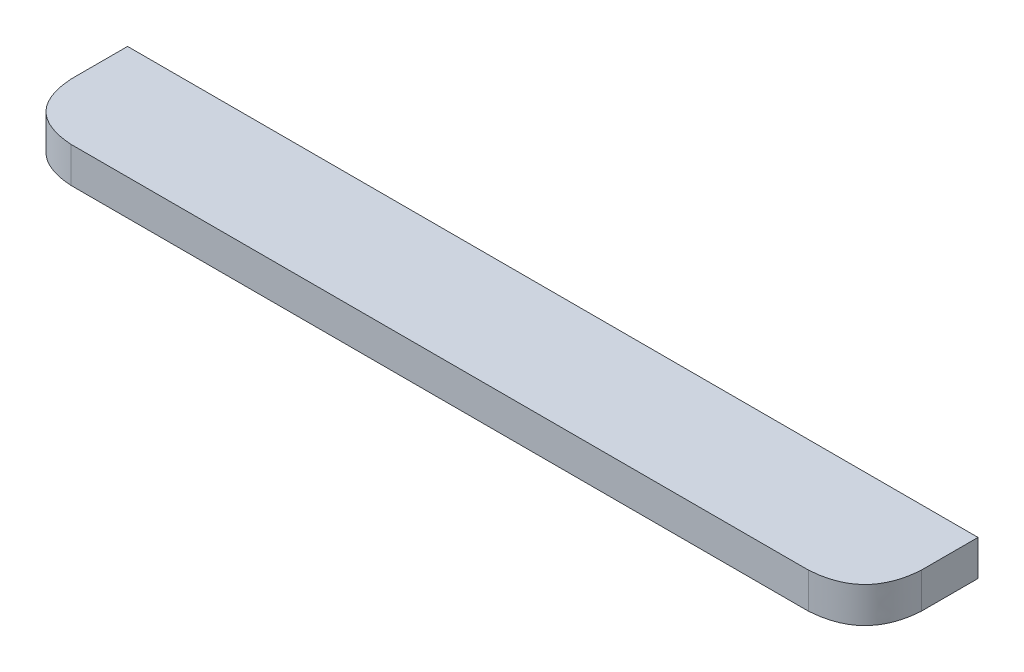
ISO-10303-21;
HEADER;
FILE_DESCRIPTION(('STEP AP214'),'2;1');
FILE_NAME('part.step','',(''),(''),'','','');
FILE_SCHEMA(('AUTOMOTIVE_DESIGN { 1 0 10303 214 1 1 1 1 }'));
ENDSEC;
DATA;
#1=APPLICATION_CONTEXT('core data for automotive mechanical design processes');
#2=APPLICATION_PROTOCOL_DEFINITION('international standard','automotive_design',2000,#1);
#3=PRODUCT_CONTEXT('',#1,'mechanical');
#4=PRODUCT('Part','Part','',(#3));
#5=PRODUCT_RELATED_PRODUCT_CATEGORY('part','',(#4));
#6=PRODUCT_DEFINITION_FORMATION('','',#4);
#7=PRODUCT_DEFINITION_CONTEXT('part definition',#1,'design');
#8=PRODUCT_DEFINITION('design','',#6,#7);
#9=PRODUCT_DEFINITION_SHAPE('','',#8);
#10=(LENGTH_UNIT() NAMED_UNIT(*) SI_UNIT(.MILLI.,.METRE.));
#11=(NAMED_UNIT(*) PLANE_ANGLE_UNIT() SI_UNIT($,.RADIAN.));
#12=(NAMED_UNIT(*) SI_UNIT($,.STERADIAN.) SOLID_ANGLE_UNIT());
#13=UNCERTAINTY_MEASURE_WITH_UNIT(LENGTH_MEASURE(1.E-05),#10,'distance_accuracy_value','');
#14=(GEOMETRIC_REPRESENTATION_CONTEXT(3) GLOBAL_UNCERTAINTY_ASSIGNED_CONTEXT((#13)) GLOBAL_UNIT_ASSIGNED_CONTEXT((#10,
#11,#12)) REPRESENTATION_CONTEXT('',''));
#15=CARTESIAN_POINT('',(0.,0.,0.));
#16=DIRECTION('',(0.,0.,1.));
#17=DIRECTION('',(1.,0.,0.));
#18=AXIS2_PLACEMENT_3D('',#15,#16,#17);
#19=CARTESIAN_POINT('',(95.5039999999999,8.,0.));
#20=DIRECTION('',(-1.,0.,0.));
#21=DIRECTION('',(0.,0.,1.));
#22=AXIS2_PLACEMENT_3D('',#19,#20,#21);
#23=PLANE('',#22);
#24=DIRECTION('',(0.,0.,-1.));
#25=VECTOR('',#24,1.);
#26=CARTESIAN_POINT('',(95.5039999999999,0.,0.));
#27=LINE('',#26,#25);
#28=CARTESIAN_POINT('',(95.504,0.,0.));
#29=VERTEX_POINT('',#28);
#30=CARTESIAN_POINT('',(95.5039999999999,0.,-12.7));
#31=VERTEX_POINT('',#30);
#32=EDGE_CURVE('E138',#29,#31,#27,.T.);
#33=ORIENTED_EDGE('',*,*,#32,.T.);
#34=DIRECTION('',(0.,-1.,0.));
#35=VECTOR('',#34,1.);
#36=CARTESIAN_POINT('',(95.5039999999999,8.,-12.7));
#37=LINE('',#36,#35);
#38=CARTESIAN_POINT('',(95.5039999999999,8.,-12.7));
#39=VERTEX_POINT('',#38);
#40=EDGE_CURVE('E11',#39,#31,#37,.T.);
#41=ORIENTED_EDGE('',*,*,#40,.F.);
#42=DIRECTION('',(0.,0.,-1.));
#43=VECTOR('',#42,1.);
#44=CARTESIAN_POINT('',(95.5039999999999,8.,0.));
#45=LINE('',#44,#43);
#46=CARTESIAN_POINT('',(95.504,8.,0.));
#47=VERTEX_POINT('',#46);
#48=EDGE_CURVE('E189',#47,#39,#45,.T.);
#49=ORIENTED_EDGE('',*,*,#48,.F.);
#50=DIRECTION('',(0.,-1.,0.));
#51=VECTOR('',#50,1.);
#52=CARTESIAN_POINT('',(95.504,8.,0.));
#53=LINE('',#52,#51);
#54=EDGE_CURVE('E128',#47,#29,#53,.T.);
#55=ORIENTED_EDGE('',*,*,#54,.T.);
#56=EDGE_LOOP('',(#33,#41,#49,#55));
#57=FACE_BOUND('',#56,.T.);
#58=ADVANCED_FACE('F43',(#57),#23,.F.);
#59=CARTESIAN_POINT('',(-95.504,8.,-12.7));
#60=DIRECTION('',(0.,0.,1.));
#61=DIRECTION('',(1.,0.,0.));
#62=AXIS2_PLACEMENT_3D('',#59,#60,#61);
#63=PLANE('',#62);
#64=DIRECTION('',(-1.,0.,0.));
#65=VECTOR('',#64,1.);
#66=CARTESIAN_POINT('',(-95.504,0.,-12.7));
#67=LINE('',#66,#65);
#68=CARTESIAN_POINT('',(-95.504,0.,-12.7));
#69=VERTEX_POINT('',#68);
#70=EDGE_CURVE('E163',#31,#69,#67,.T.);
#71=ORIENTED_EDGE('',*,*,#70,.T.);
#72=DIRECTION('',(0.,-1.,0.));
#73=VECTOR('',#72,1.);
#74=CARTESIAN_POINT('',(-95.504,8.,-12.7));
#75=LINE('',#74,#73);
#76=CARTESIAN_POINT('',(-95.504,8.,-12.7));
#77=VERTEX_POINT('',#76);
#78=EDGE_CURVE('E52',#77,#69,#75,.T.);
#79=ORIENTED_EDGE('',*,*,#78,.F.);
#80=DIRECTION('',(-1.,0.,0.));
#81=VECTOR('',#80,1.);
#82=CARTESIAN_POINT('',(-95.504,8.,-12.7));
#83=LINE('',#82,#81);
#84=EDGE_CURVE('E97',#39,#77,#83,.T.);
#85=ORIENTED_EDGE('',*,*,#84,.F.);
#86=ORIENTED_EDGE('',*,*,#40,.T.);
#87=EDGE_LOOP('',(#71,#79,#85,#86));
#88=FACE_BOUND('',#87,.T.);
#89=ADVANCED_FACE('F156',(#88),#63,.F.);
#90=CARTESIAN_POINT('',(-95.5039999999999,8.,-8.29683544090186E-13));
#91=DIRECTION('',(1.,0.,0.));
#92=DIRECTION('',(0.,0.,-1.));
#93=AXIS2_PLACEMENT_3D('',#90,#91,#92);
#94=PLANE('',#93);
#95=DIRECTION('',(0.,0.,1.));
#96=VECTOR('',#95,1.);
#97=CARTESIAN_POINT('',(-95.5039999999999,0.,-8.29683544090186E-13));
#98=LINE('',#97,#96);
#99=CARTESIAN_POINT('',(-95.5039999999999,0.,-8.29683544090186E-13));
#100=VERTEX_POINT('',#99);
#101=EDGE_CURVE('E171',#69,#100,#98,.T.);
#102=ORIENTED_EDGE('',*,*,#101,.T.);
#103=DIRECTION('',(0.,-1.,0.));
#104=VECTOR('',#103,1.);
#105=CARTESIAN_POINT('',(-95.5039999999999,8.,-8.29683544090186E-13));
#106=LINE('',#105,#104);
#107=CARTESIAN_POINT('',(-95.5039999999999,8.,-8.29683544090186E-13));
#108=VERTEX_POINT('',#107);
#109=EDGE_CURVE('E121',#108,#100,#106,.T.);
#110=ORIENTED_EDGE('',*,*,#109,.F.);
#111=DIRECTION('',(0.,0.,1.));
#112=VECTOR('',#111,1.);
#113=CARTESIAN_POINT('',(-95.5039999999999,8.,-8.29683544090186E-13));
#114=LINE('',#113,#112);
#115=EDGE_CURVE('E110',#77,#108,#114,.T.);
#116=ORIENTED_EDGE('',*,*,#115,.F.);
#117=ORIENTED_EDGE('',*,*,#78,.T.);
#118=EDGE_LOOP('',(#102,#110,#116,#117));
#119=FACE_BOUND('',#118,.T.);
#120=ADVANCED_FACE('F154',(#119),#94,.F.);
#121=CARTESIAN_POINT('',(-95.504,8.,0.));
#122=CARTESIAN_POINT('',(-94.7737224869806,8.,11.9697224869803));
#123=CARTESIAN_POINT('',(-82.804,8.,12.6999999999993));
#124=B_SPLINE_CURVE_WITH_KNOTS('',2,(#121,#122,#123),.UNSPECIFIED.,.F.,.F.,(3,3),(0.,1.),.UNSPECIFIED.);
#125=DIRECTION('',(0.,-1.,0.));
#126=VECTOR('',#125,1.);
#127=SURFACE_OF_LINEAR_EXTRUSION('',#124,#126);
#128=CARTESIAN_POINT('',(-95.504,0.,0.));
#129=CARTESIAN_POINT('',(-94.7737224869806,0.,11.9697224869803));
#130=CARTESIAN_POINT('',(-82.804,0.,12.6999999999993));
#131=B_SPLINE_CURVE_WITH_KNOTS('',2,(#128,#129,#130),.UNSPECIFIED.,.F.,.F.,(3,3),(0.,1.),.UNSPECIFIED.);
#132=CARTESIAN_POINT('',(-82.804,0.,12.6999999999993));
#133=VERTEX_POINT('',#132);
#134=EDGE_CURVE('E119',#100,#133,#131,.T.);
#135=ORIENTED_EDGE('',*,*,#134,.T.);
#136=DIRECTION('',(0.,-1.,0.));
#137=VECTOR('',#136,1.);
#138=CARTESIAN_POINT('',(-82.804,8.,12.6999999999993));
#139=LINE('',#138,#137);
#140=CARTESIAN_POINT('',(-82.804,8.,12.6999999999993));
#141=VERTEX_POINT('',#140);
#142=EDGE_CURVE('E116',#141,#133,#139,.T.);
#143=ORIENTED_EDGE('',*,*,#142,.F.);
#144=EDGE_CURVE('E104',#108,#141,#124,.T.);
#145=ORIENTED_EDGE('',*,*,#144,.F.);
#146=ORIENTED_EDGE('',*,*,#109,.T.);
#147=EDGE_LOOP('',(#135,#143,#145,#146));
#148=FACE_BOUND('',#147,.T.);
#149=ADVANCED_FACE('F117',(#148),#127,.F.);
#150=CARTESIAN_POINT('',(-82.804,8.,12.6999999999993));
#151=DIRECTION('',(0.,0.,-1.));
#152=DIRECTION('',(-1.,0.,0.));
#153=AXIS2_PLACEMENT_3D('',#150,#151,#152);
#154=PLANE('',#153);
#155=DIRECTION('',(1.,0.,0.));
#156=VECTOR('',#155,1.);
#157=CARTESIAN_POINT('',(-82.804,0.,12.6999999999993));
#158=LINE('',#157,#156);
#159=CARTESIAN_POINT('',(82.8039999999999,0.,12.7));
#160=VERTEX_POINT('',#159);
#161=EDGE_CURVE('E83',#133,#160,#158,.T.);
#162=ORIENTED_EDGE('',*,*,#161,.T.);
#163=DIRECTION('',(0.,-1.,0.));
#164=VECTOR('',#163,1.);
#165=CARTESIAN_POINT('',(82.8039999999999,8.,12.7));
#166=LINE('',#165,#164);
#167=CARTESIAN_POINT('',(82.8039999999999,8.,12.7));
#168=VERTEX_POINT('',#167);
#169=EDGE_CURVE('E122',#168,#160,#166,.T.);
#170=ORIENTED_EDGE('',*,*,#169,.F.);
#171=DIRECTION('',(1.,0.,0.));
#172=VECTOR('',#171,1.);
#173=CARTESIAN_POINT('',(-82.804,8.,12.6999999999993));
#174=LINE('',#173,#172);
#175=EDGE_CURVE('E108',#141,#168,#174,.T.);
#176=ORIENTED_EDGE('',*,*,#175,.F.);
#177=ORIENTED_EDGE('',*,*,#142,.T.);
#178=EDGE_LOOP('',(#162,#170,#176,#177));
#179=FACE_BOUND('',#178,.T.);
#180=ADVANCED_FACE('F124',(#179),#154,.F.);
#181=CARTESIAN_POINT('',(82.804,8.,12.6999999999993));
#182=CARTESIAN_POINT('',(94.7737224869806,8.,11.9697224869803));
#183=CARTESIAN_POINT('',(95.504,8.,0.));
#184=B_SPLINE_CURVE_WITH_KNOTS('',2,(#181,#182,#183),.UNSPECIFIED.,.F.,.F.,(3,3),(0.,1.),.UNSPECIFIED.);
#185=DIRECTION('',(0.,-1.,0.));
#186=VECTOR('',#185,1.);
#187=SURFACE_OF_LINEAR_EXTRUSION('',#184,#186);
#188=CARTESIAN_POINT('',(82.804,0.,12.6999999999993));
#189=CARTESIAN_POINT('',(94.7737224869806,0.,11.9697224869803));
#190=CARTESIAN_POINT('',(95.504,0.,0.));
#191=B_SPLINE_CURVE_WITH_KNOTS('',2,(#188,#189,#190),.UNSPECIFIED.,.F.,.F.,(3,3),(0.,1.),.UNSPECIFIED.);
#192=EDGE_CURVE('E89',#160,#29,#191,.T.);
#193=ORIENTED_EDGE('',*,*,#192,.T.);
#194=ORIENTED_EDGE('',*,*,#54,.F.);
#195=EDGE_CURVE('E60',#168,#47,#184,.T.);
#196=ORIENTED_EDGE('',*,*,#195,.F.);
#197=ORIENTED_EDGE('',*,*,#169,.T.);
#198=EDGE_LOOP('',(#193,#194,#196,#197));
#199=FACE_BOUND('',#198,.T.);
#200=ADVANCED_FACE('F144',(#199),#187,.F.);
#201=CARTESIAN_POINT('',(-91.9638612434903,8.,9.15986124348997));
#202=DIRECTION('',(0.,1.,0.));
#203=DIRECTION('',(0.,0.,1.));
#204=AXIS2_PLACEMENT_3D('',#201,#202,#203);
#205=PLANE('',#204);
#206=ORIENTED_EDGE('',*,*,#48,.T.);
#207=ORIENTED_EDGE('',*,*,#84,.T.);
#208=ORIENTED_EDGE('',*,*,#115,.T.);
#209=ORIENTED_EDGE('',*,*,#144,.T.);
#210=ORIENTED_EDGE('',*,*,#175,.T.);
#211=ORIENTED_EDGE('',*,*,#195,.T.);
#212=EDGE_LOOP('',(#206,#207,#208,#209,#210,#211));
#213=FACE_BOUND('',#212,.T.);
#214=ADVANCED_FACE('F106',(#213),#205,.T.);
#215=CARTESIAN_POINT('',(-91.9638612434903,0.,9.15986124348997));
#216=DIRECTION('',(0.,1.,0.));
#217=DIRECTION('',(0.,0.,1.));
#218=AXIS2_PLACEMENT_3D('',#215,#216,#217);
#219=PLANE('',#218);
#220=ORIENTED_EDGE('',*,*,#32,.F.);
#221=ORIENTED_EDGE('',*,*,#192,.F.);
#222=ORIENTED_EDGE('',*,*,#161,.F.);
#223=ORIENTED_EDGE('',*,*,#134,.F.);
#224=ORIENTED_EDGE('',*,*,#101,.F.);
#225=ORIENTED_EDGE('',*,*,#70,.F.);
#226=EDGE_LOOP('',(#220,#221,#222,#223,#224,#225));
#227=FACE_BOUND('',#226,.T.);
#228=ADVANCED_FACE('F148',(#227),#219,.F.);
#229=CLOSED_SHELL('',(#58,#89,#120,#149,#180,#200,#214,#228));
#230=MANIFOLD_SOLID_BREP('B2',#229);
#231=ADVANCED_BREP_SHAPE_REPRESENTATION('',(#18,#230),#14);
#232=SHAPE_DEFINITION_REPRESENTATION(#9,#231);
ENDSEC;
END-ISO-10303-21;
